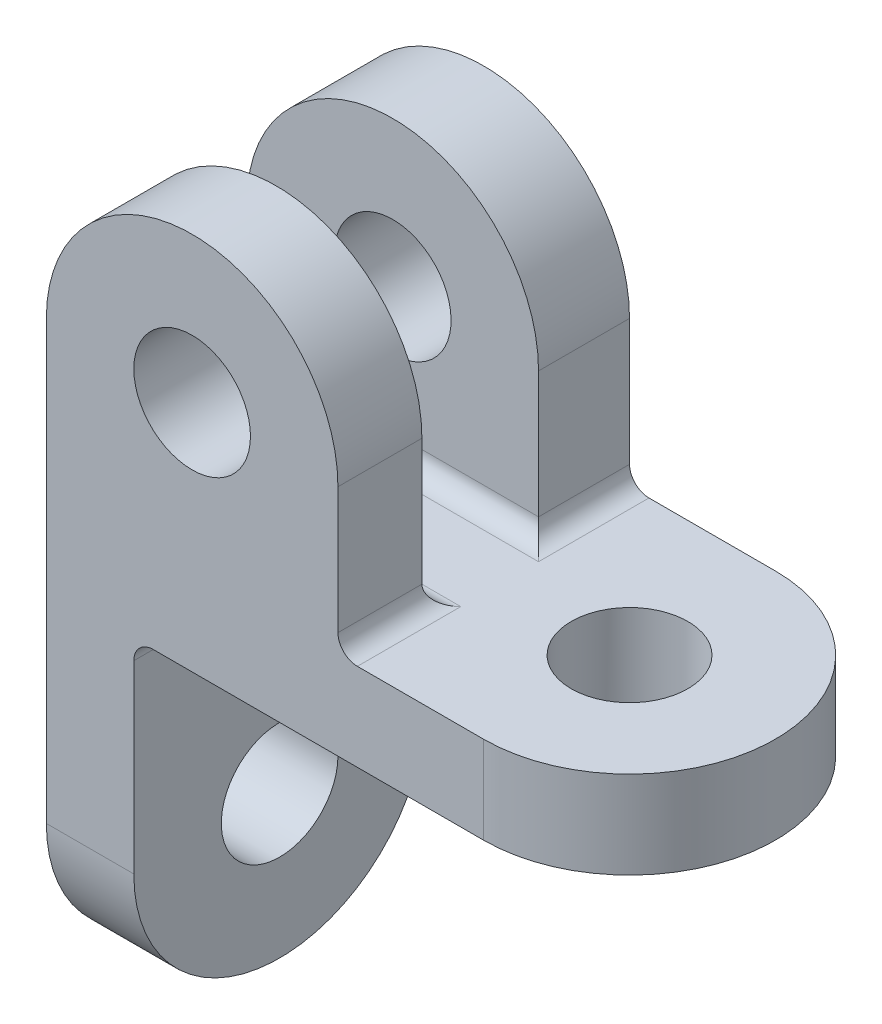
ISO-10303-21;
HEADER;
FILE_DESCRIPTION(('STEP AP214'),'2;1');
FILE_NAME('part.step','',(''),(''),'','','');
FILE_SCHEMA(('AUTOMOTIVE_DESIGN { 1 0 10303 214 1 1 1 1 }'));
ENDSEC;
DATA;
#1=APPLICATION_CONTEXT('core data for automotive mechanical design processes');
#2=APPLICATION_PROTOCOL_DEFINITION('international standard','automotive_design',2000,#1);
#3=PRODUCT_CONTEXT('',#1,'mechanical');
#4=PRODUCT('Part','Part','',(#3));
#5=PRODUCT_RELATED_PRODUCT_CATEGORY('part','',(#4));
#6=PRODUCT_DEFINITION_FORMATION('','',#4);
#7=PRODUCT_DEFINITION_CONTEXT('part definition',#1,'design');
#8=PRODUCT_DEFINITION('design','',#6,#7);
#9=PRODUCT_DEFINITION_SHAPE('','',#8);
#10=(LENGTH_UNIT() NAMED_UNIT(*) SI_UNIT(.MILLI.,.METRE.));
#11=(NAMED_UNIT(*) PLANE_ANGLE_UNIT() SI_UNIT($,.RADIAN.));
#12=(NAMED_UNIT(*) SI_UNIT($,.STERADIAN.) SOLID_ANGLE_UNIT());
#13=UNCERTAINTY_MEASURE_WITH_UNIT(LENGTH_MEASURE(1.E-05),#10,'distance_accuracy_value','');
#14=(GEOMETRIC_REPRESENTATION_CONTEXT(3) GLOBAL_UNCERTAINTY_ASSIGNED_CONTEXT((#13)) GLOBAL_UNIT_ASSIGNED_CONTEXT((#10,
#11,#12)) REPRESENTATION_CONTEXT('',''));
#15=CARTESIAN_POINT('',(0.,0.,0.));
#16=DIRECTION('',(0.,0.,1.));
#17=DIRECTION('',(1.,0.,0.));
#18=AXIS2_PLACEMENT_3D('',#15,#16,#17);
#19=CARTESIAN_POINT('',(0.,15.,30.));
#20=DIRECTION('',(0.,0.,-1.));
#21=DIRECTION('',(-1.,0.,0.));
#22=AXIS2_PLACEMENT_3D('',#19,#20,#21);
#23=CYLINDRICAL_SURFACE('',#22,15.);
#24=CARTESIAN_POINT('',(0.,15.,9.35995053907442));
#25=DIRECTION('',(0.,0.,1.));
#26=DIRECTION('',(0.,-1.,0.));
#27=AXIS2_PLACEMENT_3D('',#24,#25,#26);
#28=CIRCLE('',#27,15.);
#29=CARTESIAN_POINT('',(15.,15.,9.35995053907442));
#30=VERTEX_POINT('',#29);
#31=CARTESIAN_POINT('',(-15.,15.,9.35995053907442));
#32=VERTEX_POINT('',#31);
#33=EDGE_CURVE('E455',#30,#32,#28,.T.);
#34=ORIENTED_EDGE('',*,*,#33,.F.);
#35=DIRECTION('',(0.,0.,-1.));
#36=VECTOR('',#35,1.);
#37=CARTESIAN_POINT('',(15.,15.,30.));
#38=LINE('',#37,#36);
#39=CARTESIAN_POINT('',(15.,15.,0.));
#40=VERTEX_POINT('',#39);
#41=EDGE_CURVE('E189',#30,#40,#38,.T.);
#42=ORIENTED_EDGE('',*,*,#41,.T.);
#43=CARTESIAN_POINT('',(0.,15.,0.));
#44=DIRECTION('',(0.,0.,1.));
#45=DIRECTION('',(1.,0.,0.));
#46=AXIS2_PLACEMENT_3D('',#43,#44,#45);
#47=CIRCLE('',#46,15.);
#48=CARTESIAN_POINT('',(-15.,15.,0.));
#49=VERTEX_POINT('',#48);
#50=EDGE_CURVE('E322',#40,#49,#47,.T.);
#51=ORIENTED_EDGE('',*,*,#50,.T.);
#52=DIRECTION('',(0.,0.,-1.));
#53=VECTOR('',#52,1.);
#54=CARTESIAN_POINT('',(-15.,15.,30.));
#55=LINE('',#54,#53);
#56=EDGE_CURVE('E188',#32,#49,#55,.T.);
#57=ORIENTED_EDGE('',*,*,#56,.F.);
#58=EDGE_LOOP('',(#34,#42,#51,#57));
#59=FACE_BOUND('',#58,.T.);
#60=ADVANCED_FACE('F44',(#59),#23,.T.);
#61=CARTESIAN_POINT('',(0.,15.,21.3599505390744));
#62=DIRECTION('',(0.,0.,-1.));
#63=DIRECTION('',(-1.,0.,0.));
#64=AXIS2_PLACEMENT_3D('',#61,#62,#63);
#65=CIRCLE('',#64,15.);
#66=CARTESIAN_POINT('',(-15.,15.,21.3599505390744));
#67=VERTEX_POINT('',#66);
#68=CARTESIAN_POINT('',(15.,15.,21.3599505390744));
#69=VERTEX_POINT('',#68);
#70=EDGE_CURVE('E160',#67,#69,#65,.T.);
#71=ORIENTED_EDGE('',*,*,#70,.F.);
#72=CARTESIAN_POINT('',(-15.,15.,30.));
#73=VERTEX_POINT('',#72);
#74=EDGE_CURVE('E193',#73,#67,#55,.T.);
#75=ORIENTED_EDGE('',*,*,#74,.F.);
#76=CARTESIAN_POINT('',(0.,15.,30.));
#77=DIRECTION('',(0.,0.,1.));
#78=DIRECTION('',(1.,0.,0.));
#79=AXIS2_PLACEMENT_3D('',#76,#77,#78);
#80=CIRCLE('',#79,15.);
#81=CARTESIAN_POINT('',(15.,15.,30.));
#82=VERTEX_POINT('',#81);
#83=EDGE_CURVE('E186',#82,#73,#80,.T.);
#84=ORIENTED_EDGE('',*,*,#83,.F.);
#85=EDGE_CURVE('E177',#82,#69,#38,.T.);
#86=ORIENTED_EDGE('',*,*,#85,.T.);
#87=EDGE_LOOP('',(#71,#75,#84,#86));
#88=FACE_BOUND('',#87,.T.);
#89=ADVANCED_FACE('F184',(#88),#23,.T.);
#90=CARTESIAN_POINT('',(-15.,15.,30.));
#91=DIRECTION('',(1.,0.,0.));
#92=DIRECTION('',(0.,1.,0.));
#93=AXIS2_PLACEMENT_3D('',#90,#91,#92);
#94=PLANE('',#93);
#95=CARTESIAN_POINT('',(-15.,-30.,15.));
#96=DIRECTION('',(1.,0.,0.));
#97=DIRECTION('',(0.,1.,0.));
#98=AXIS2_PLACEMENT_3D('',#95,#96,#97);
#99=CIRCLE('',#98,6.);
#100=CARTESIAN_POINT('',(-15.,-24.,15.));
#101=VERTEX_POINT('',#100);
#102=EDGE_CURVE('E235',#101,#101,#99,.T.);
#103=ORIENTED_EDGE('',*,*,#102,.T.);
#104=EDGE_LOOP('',(#103));
#105=FACE_BOUND('',#104,.T.);
#106=DIRECTION('',(0.,-1.,0.));
#107=VECTOR('',#106,1.);
#108=CARTESIAN_POINT('',(-15.,15.,9.35995053907442));
#109=LINE('',#108,#107);
#110=CARTESIAN_POINT('',(-15.,1.99999999999999,9.35995053907441));
#111=VERTEX_POINT('',#110);
#112=EDGE_CURVE('E458',#32,#111,#109,.T.);
#113=ORIENTED_EDGE('',*,*,#112,.F.);
#114=ORIENTED_EDGE('',*,*,#56,.T.);
#115=DIRECTION('',(0.,-1.,0.));
#116=VECTOR('',#115,1.);
#117=CARTESIAN_POINT('',(-15.,15.,0.));
#118=LINE('',#117,#116);
#119=CARTESIAN_POINT('',(-15.,-30.,0.));
#120=VERTEX_POINT('',#119);
#121=EDGE_CURVE('E326',#49,#120,#118,.T.);
#122=ORIENTED_EDGE('',*,*,#121,.T.);
#123=CARTESIAN_POINT('',(-15.,-30.,15.));
#124=DIRECTION('',(1.,0.,0.));
#125=DIRECTION('',(0.,1.,0.));
#126=AXIS2_PLACEMENT_3D('',#123,#124,#125);
#127=CIRCLE('',#126,15.);
#128=CARTESIAN_POINT('',(-15.,-30.,30.));
#129=VERTEX_POINT('',#128);
#130=EDGE_CURVE('E225',#120,#129,#127,.F.);
#131=ORIENTED_EDGE('',*,*,#130,.T.);
#132=DIRECTION('',(0.,-1.,0.));
#133=VECTOR('',#132,1.);
#134=CARTESIAN_POINT('',(-15.,15.,30.));
#135=LINE('',#134,#133);
#136=EDGE_CURVE('E345',#73,#129,#135,.T.);
#137=ORIENTED_EDGE('',*,*,#136,.F.);
#138=ORIENTED_EDGE('',*,*,#74,.T.);
#139=DIRECTION('',(0.,1.,0.));
#140=VECTOR('',#139,1.);
#141=CARTESIAN_POINT('',(-15.,15.,21.3599505390744));
#142=LINE('',#141,#140);
#143=CARTESIAN_POINT('',(-15.,1.99999999999999,21.3599505390744));
#144=VERTEX_POINT('',#143);
#145=EDGE_CURVE('E167',#144,#67,#142,.T.);
#146=ORIENTED_EDGE('',*,*,#145,.F.);
#147=CARTESIAN_POINT('',(-15.,1.99999999999999,19.3599505390744));
#148=DIRECTION('',(1.,0.,0.));
#149=DIRECTION('',(0.,1.,0.));
#150=AXIS2_PLACEMENT_3D('',#147,#148,#149);
#151=CIRCLE('',#150,2.);
#152=CARTESIAN_POINT('',(-15.,2.04662675695744E-11,19.3599505390744));
#153=VERTEX_POINT('',#152);
#154=EDGE_CURVE('E279',#144,#153,#151,.T.);
#155=ORIENTED_EDGE('',*,*,#154,.T.);
#156=DIRECTION('',(0.,0.,1.));
#157=VECTOR('',#156,1.);
#158=CARTESIAN_POINT('',(-15.,2.04662675695744E-11,30.));
#159=LINE('',#158,#157);
#160=CARTESIAN_POINT('',(-15.,2.04662675695744E-11,11.3599505390744));
#161=VERTEX_POINT('',#160);
#162=EDGE_CURVE('E462',#161,#153,#159,.T.);
#163=ORIENTED_EDGE('',*,*,#162,.F.);
#164=CARTESIAN_POINT('',(-15.,1.99999999999999,11.3599505390744));
#165=DIRECTION('',(1.,0.,0.));
#166=DIRECTION('',(0.,1.,0.));
#167=AXIS2_PLACEMENT_3D('',#164,#165,#166);
#168=CIRCLE('',#167,2.);
#169=EDGE_CURVE('E276',#161,#111,#168,.T.);
#170=ORIENTED_EDGE('',*,*,#169,.T.);
#171=EDGE_LOOP('',(#113,#114,#122,#131,#137,#138,#146,#155,#163,#170));
#172=FACE_BOUND('',#171,.T.);
#173=ADVANCED_FACE('F393',(#105,#172),#94,.F.);
#174=CARTESIAN_POINT('',(15.,15.,30.));
#175=DIRECTION('',(-1.,4.54728847169387E-13,0.));
#176=DIRECTION('',(-4.54728847169387E-13,-1.,0.));
#177=AXIS2_PLACEMENT_3D('',#174,#175,#176);
#178=PLANE('',#177);
#179=DIRECTION('',(4.54728847169387E-13,1.,0.));
#180=VECTOR('',#179,1.);
#181=CARTESIAN_POINT('',(15.,15.,9.35995053907442));
#182=LINE('',#181,#180);
#183=CARTESIAN_POINT('',(14.9999999999941,2.00000000000091,9.35995053907441));
#184=VERTEX_POINT('',#183);
#185=EDGE_CURVE('E240',#184,#30,#182,.T.);
#186=ORIENTED_EDGE('',*,*,#185,.F.);
#187=DIRECTION('',(0.,0.,-1.));
#188=VECTOR('',#187,1.);
#189=CARTESIAN_POINT('',(14.9999999999941,2.00000000000091,0.));
#190=LINE('',#189,#188);
#191=CARTESIAN_POINT('',(14.9999999999941,2.00000000000091,0.));
#192=VERTEX_POINT('',#191);
#193=EDGE_CURVE('E68',#184,#192,#190,.T.);
#194=ORIENTED_EDGE('',*,*,#193,.T.);
#195=DIRECTION('',(4.54728847169387E-13,1.,0.));
#196=VECTOR('',#195,1.);
#197=CARTESIAN_POINT('',(15.,15.,0.));
#198=LINE('',#197,#196);
#199=EDGE_CURVE('E198',#192,#40,#198,.T.);
#200=ORIENTED_EDGE('',*,*,#199,.T.);
#201=ORIENTED_EDGE('',*,*,#41,.F.);
#202=EDGE_LOOP('',(#186,#194,#200,#201));
#203=FACE_BOUND('',#202,.T.);
#204=ADVANCED_FACE('F398',(#203),#178,.F.);
#205=DIRECTION('',(4.54728847169387E-13,1.,0.));
#206=VECTOR('',#205,1.);
#207=CARTESIAN_POINT('',(15.,15.,30.));
#208=LINE('',#207,#206);
#209=CARTESIAN_POINT('',(14.9999999999941,2.00000000000091,30.));
#210=VERTEX_POINT('',#209);
#211=EDGE_CURVE('E196',#210,#82,#208,.T.);
#212=ORIENTED_EDGE('',*,*,#211,.F.);
#213=DIRECTION('',(0.,0.,-1.));
#214=VECTOR('',#213,1.);
#215=CARTESIAN_POINT('',(14.9999999999941,2.00000000000091,21.3599505390744));
#216=LINE('',#215,#214);
#217=CARTESIAN_POINT('',(14.9999999999941,2.00000000000091,21.3599505390744));
#218=VERTEX_POINT('',#217);
#219=EDGE_CURVE('E180',#210,#218,#216,.T.);
#220=ORIENTED_EDGE('',*,*,#219,.T.);
#221=DIRECTION('',(-4.54728847169387E-13,-1.,0.));
#222=VECTOR('',#221,1.);
#223=CARTESIAN_POINT('',(15.,15.,21.3599505390744));
#224=LINE('',#223,#222);
#225=EDGE_CURVE('E164',#69,#218,#224,.T.);
#226=ORIENTED_EDGE('',*,*,#225,.F.);
#227=ORIENTED_EDGE('',*,*,#85,.F.);
#228=EDGE_LOOP('',(#212,#220,#226,#227));
#229=FACE_BOUND('',#228,.T.);
#230=ADVANCED_FACE('F176',(#229),#178,.F.);
#231=CARTESIAN_POINT('',(0.,15.,30.));
#232=DIRECTION('',(0.,0.,-1.));
#233=DIRECTION('',(-1.,0.,0.));
#234=AXIS2_PLACEMENT_3D('',#231,#232,#233);
#235=CYLINDRICAL_SURFACE('',#234,6.);
#236=CARTESIAN_POINT('',(0.,15.,0.));
#237=DIRECTION('',(0.,0.,1.));
#238=DIRECTION('',(1.,0.,0.));
#239=AXIS2_PLACEMENT_3D('',#236,#237,#238);
#240=CIRCLE('',#239,6.);
#241=CARTESIAN_POINT('',(6.,15.,0.));
#242=VERTEX_POINT('',#241);
#243=EDGE_CURVE('E350',#242,#242,#240,.T.);
#244=ORIENTED_EDGE('',*,*,#243,.F.);
#245=EDGE_LOOP('',(#244));
#246=FACE_BOUND('',#245,.T.);
#247=CARTESIAN_POINT('',(0.,15.,9.35995053907442));
#248=DIRECTION('',(0.,0.,1.));
#249=DIRECTION('',(0.,-1.,0.));
#250=AXIS2_PLACEMENT_3D('',#247,#248,#249);
#251=CIRCLE('',#250,6.);
#252=CARTESIAN_POINT('',(0.,9.,9.35995053907442));
#253=VERTEX_POINT('',#252);
#254=EDGE_CURVE('E236',#253,#253,#251,.T.);
#255=ORIENTED_EDGE('',*,*,#254,.T.);
#256=EDGE_LOOP('',(#255));
#257=FACE_BOUND('',#256,.T.);
#258=ADVANCED_FACE('F415',(#246,#257),#235,.F.);
#259=CARTESIAN_POINT('',(0.,15.,30.));
#260=DIRECTION('',(0.,0.,1.));
#261=DIRECTION('',(1.,0.,0.));
#262=AXIS2_PLACEMENT_3D('',#259,#260,#261);
#263=CIRCLE('',#262,6.);
#264=CARTESIAN_POINT('',(6.,15.,30.));
#265=VERTEX_POINT('',#264);
#266=EDGE_CURVE('E327',#265,#265,#263,.T.);
#267=ORIENTED_EDGE('',*,*,#266,.T.);
#268=EDGE_LOOP('',(#267));
#269=FACE_BOUND('',#268,.T.);
#270=CARTESIAN_POINT('',(0.,15.,21.3599505390744));
#271=DIRECTION('',(0.,0.,-1.));
#272=DIRECTION('',(-1.,0.,0.));
#273=AXIS2_PLACEMENT_3D('',#270,#271,#272);
#274=CIRCLE('',#273,6.);
#275=CARTESIAN_POINT('',(-6.,15.,21.3599505390744));
#276=VERTEX_POINT('',#275);
#277=EDGE_CURVE('E182',#276,#276,#274,.T.);
#278=ORIENTED_EDGE('',*,*,#277,.T.);
#279=EDGE_LOOP('',(#278));
#280=FACE_BOUND('',#279,.T.);
#281=ADVANCED_FACE('F383',(#269,#280),#235,.F.);
#282=CARTESIAN_POINT('',(-15.,-30.,15.));
#283=DIRECTION('',(1.,0.,0.));
#284=DIRECTION('',(0.,0.,-1.));
#285=AXIS2_PLACEMENT_3D('',#282,#283,#284);
#286=CYLINDRICAL_SURFACE('',#285,15.);
#287=DIRECTION('',(-1.,0.,0.));
#288=VECTOR('',#287,1.);
#289=CARTESIAN_POINT('',(-15.,-30.,30.));
#290=LINE('',#289,#288);
#291=CARTESIAN_POINT('',(-5.99999999999999,-30.,30.));
#292=VERTEX_POINT('',#291);
#293=EDGE_CURVE('E217',#129,#292,#290,.F.);
#294=ORIENTED_EDGE('',*,*,#293,.F.);
#295=ORIENTED_EDGE('',*,*,#130,.F.);
#296=DIRECTION('',(1.,0.,0.));
#297=VECTOR('',#296,1.);
#298=CARTESIAN_POINT('',(0.,-30.,0.));
#299=LINE('',#298,#297);
#300=CARTESIAN_POINT('',(-5.99999999999999,-30.,0.));
#301=VERTEX_POINT('',#300);
#302=EDGE_CURVE('E221',#301,#120,#299,.F.);
#303=ORIENTED_EDGE('',*,*,#302,.F.);
#304=CARTESIAN_POINT('',(-5.99999999999999,-30.,15.));
#305=DIRECTION('',(-1.,0.,0.));
#306=DIRECTION('',(0.,0.,1.));
#307=AXIS2_PLACEMENT_3D('',#304,#305,#306);
#308=CIRCLE('',#307,15.);
#309=EDGE_CURVE('E228',#292,#301,#308,.F.);
#310=ORIENTED_EDGE('',*,*,#309,.F.);
#311=EDGE_LOOP('',(#294,#295,#303,#310));
#312=FACE_BOUND('',#311,.T.);
#313=ADVANCED_FACE('F375',(#312),#286,.T.);
#314=CARTESIAN_POINT('',(30.,-9.00000000000001,15.));
#315=DIRECTION('',(0.,1.,0.));
#316=DIRECTION('',(-1.,0.,0.));
#317=AXIS2_PLACEMENT_3D('',#314,#315,#316);
#318=CYLINDRICAL_SURFACE('',#317,15.);
#319=DIRECTION('',(0.,-1.,0.));
#320=VECTOR('',#319,1.);
#321=CARTESIAN_POINT('',(30.,-9.00000000000001,30.));
#322=LINE('',#321,#320);
#323=CARTESIAN_POINT('',(30.,-9.00000000000001,30.));
#324=VERTEX_POINT('',#323);
#325=CARTESIAN_POINT('',(30.,0.,30.));
#326=VERTEX_POINT('',#325);
#327=EDGE_CURVE('E202',#324,#326,#322,.F.);
#328=ORIENTED_EDGE('',*,*,#327,.F.);
#329=CARTESIAN_POINT('',(30.,-8.99999999999999,15.));
#330=DIRECTION('',(0.,1.,0.));
#331=DIRECTION('',(-1.,0.,0.));
#332=AXIS2_PLACEMENT_3D('',#329,#330,#331);
#333=CIRCLE('',#332,15.);
#334=CARTESIAN_POINT('',(30.,-8.99999999999999,0.));
#335=VERTEX_POINT('',#334);
#336=EDGE_CURVE('E210',#335,#324,#333,.F.);
#337=ORIENTED_EDGE('',*,*,#336,.F.);
#338=DIRECTION('',(0.,1.,0.));
#339=VECTOR('',#338,1.);
#340=CARTESIAN_POINT('',(30.,15.,0.));
#341=LINE('',#340,#339);
#342=CARTESIAN_POINT('',(30.,0.,0.));
#343=VERTEX_POINT('',#342);
#344=EDGE_CURVE('E206',#343,#335,#341,.F.);
#345=ORIENTED_EDGE('',*,*,#344,.F.);
#346=CARTESIAN_POINT('',(30.,0.,15.));
#347=DIRECTION('',(0.,-1.,0.));
#348=DIRECTION('',(1.,0.,0.));
#349=AXIS2_PLACEMENT_3D('',#346,#347,#348);
#350=CIRCLE('',#349,15.);
#351=EDGE_CURVE('E214',#326,#343,#350,.F.);
#352=ORIENTED_EDGE('',*,*,#351,.F.);
#353=EDGE_LOOP('',(#328,#337,#345,#352));
#354=FACE_BOUND('',#353,.T.);
#355=ADVANCED_FACE('F373',(#354),#318,.T.);
#356=CARTESIAN_POINT('',(0.,15.,30.));
#357=DIRECTION('',(0.,0.,1.));
#358=DIRECTION('',(1.,0.,0.));
#359=AXIS2_PLACEMENT_3D('',#356,#357,#358);
#360=PLANE('',#359);
#361=ORIENTED_EDGE('',*,*,#136,.T.);
#362=ORIENTED_EDGE('',*,*,#293,.T.);
#363=DIRECTION('',(0.,1.,0.));
#364=VECTOR('',#363,1.);
#365=CARTESIAN_POINT('',(-5.99999999999999,-45.,30.));
#366=LINE('',#365,#364);
#367=CARTESIAN_POINT('',(-5.99999999999999,-11.,30.));
#368=VERTEX_POINT('',#367);
#369=EDGE_CURVE('E318',#292,#368,#366,.T.);
#370=ORIENTED_EDGE('',*,*,#369,.T.);
#371=CARTESIAN_POINT('',(-4.,-11.,30.));
#372=DIRECTION('',(0.,0.,1.));
#373=DIRECTION('',(1.,0.,0.));
#374=AXIS2_PLACEMENT_3D('',#371,#372,#373);
#375=CIRCLE('',#374,2.);
#376=CARTESIAN_POINT('',(-4.,-9.,30.));
#377=VERTEX_POINT('',#376);
#378=EDGE_CURVE('E273',#368,#377,#375,.F.);
#379=ORIENTED_EDGE('',*,*,#378,.T.);
#380=DIRECTION('',(1.,0.,0.));
#381=VECTOR('',#380,1.);
#382=CARTESIAN_POINT('',(-5.99999999999999,-9.,30.));
#383=LINE('',#382,#381);
#384=EDGE_CURVE('E313',#377,#324,#383,.T.);
#385=ORIENTED_EDGE('',*,*,#384,.T.);
#386=ORIENTED_EDGE('',*,*,#327,.T.);
#387=DIRECTION('',(-1.,0.,0.));
#388=VECTOR('',#387,1.);
#389=CARTESIAN_POINT('',(14.9999999999932,0.,30.));
#390=LINE('',#389,#388);
#391=CARTESIAN_POINT('',(16.9999999999941,0.,30.));
#392=VERTEX_POINT('',#391);
#393=EDGE_CURVE('E306',#326,#392,#390,.T.);
#394=ORIENTED_EDGE('',*,*,#393,.T.);
#395=CARTESIAN_POINT('',(16.9999999999941,2.,30.));
#396=DIRECTION('',(0.,0.,1.));
#397=DIRECTION('',(1.,0.,0.));
#398=AXIS2_PLACEMENT_3D('',#395,#396,#397);
#399=CIRCLE('',#398,2.);
#400=EDGE_CURVE('E11',#392,#210,#399,.F.);
#401=ORIENTED_EDGE('',*,*,#400,.T.);
#402=ORIENTED_EDGE('',*,*,#211,.T.);
#403=ORIENTED_EDGE('',*,*,#83,.T.);
#404=EDGE_LOOP('',(#361,#362,#370,#379,#385,#386,#394,#401,#402,#403));
#405=FACE_BOUND('',#404,.T.);
#406=ORIENTED_EDGE('',*,*,#266,.F.);
#407=EDGE_LOOP('',(#406));
#408=FACE_BOUND('',#407,.T.);
#409=ADVANCED_FACE('F309',(#405,#408),#360,.T.);
#410=CARTESIAN_POINT('',(0.,15.,0.));
#411=DIRECTION('',(0.,0.,1.));
#412=DIRECTION('',(1.,0.,0.));
#413=AXIS2_PLACEMENT_3D('',#410,#411,#412);
#414=PLANE('',#413);
#415=DIRECTION('',(0.,1.,0.));
#416=VECTOR('',#415,1.);
#417=CARTESIAN_POINT('',(-5.99999999999999,-45.,0.));
#418=LINE('',#417,#416);
#419=CARTESIAN_POINT('',(-5.99999999999999,-11.,0.));
#420=VERTEX_POINT('',#419);
#421=EDGE_CURVE('E331',#301,#420,#418,.T.);
#422=ORIENTED_EDGE('',*,*,#421,.F.);
#423=ORIENTED_EDGE('',*,*,#302,.T.);
#424=ORIENTED_EDGE('',*,*,#121,.F.);
#425=ORIENTED_EDGE('',*,*,#50,.F.);
#426=ORIENTED_EDGE('',*,*,#199,.F.);
#427=CARTESIAN_POINT('',(16.9999999999941,2.,0.));
#428=DIRECTION('',(0.,0.,1.));
#429=DIRECTION('',(1.,0.,0.));
#430=AXIS2_PLACEMENT_3D('',#427,#428,#429);
#431=CIRCLE('',#430,2.);
#432=CARTESIAN_POINT('',(16.9999999999941,0.,0.));
#433=VERTEX_POINT('',#432);
#434=EDGE_CURVE('E54',#192,#433,#431,.T.);
#435=ORIENTED_EDGE('',*,*,#434,.T.);
#436=DIRECTION('',(-1.,0.,0.));
#437=VECTOR('',#436,1.);
#438=CARTESIAN_POINT('',(14.9999999999932,0.,0.));
#439=LINE('',#438,#437);
#440=EDGE_CURVE('E337',#343,#433,#439,.T.);
#441=ORIENTED_EDGE('',*,*,#440,.F.);
#442=ORIENTED_EDGE('',*,*,#344,.T.);
#443=DIRECTION('',(1.,0.,0.));
#444=VECTOR('',#443,1.);
#445=CARTESIAN_POINT('',(45.,-8.99999999999999,0.));
#446=LINE('',#445,#444);
#447=CARTESIAN_POINT('',(-4.,-9.,0.));
#448=VERTEX_POINT('',#447);
#449=EDGE_CURVE('E335',#448,#335,#446,.T.);
#450=ORIENTED_EDGE('',*,*,#449,.F.);
#451=CARTESIAN_POINT('',(-4.,-11.,0.));
#452=DIRECTION('',(0.,0.,1.));
#453=DIRECTION('',(1.,0.,0.));
#454=AXIS2_PLACEMENT_3D('',#451,#452,#453);
#455=CIRCLE('',#454,2.);
#456=EDGE_CURVE('E270',#448,#420,#455,.T.);
#457=ORIENTED_EDGE('',*,*,#456,.T.);
#458=EDGE_LOOP('',(#422,#423,#424,#425,#426,#435,#441,#442,#450,#457));
#459=FACE_BOUND('',#458,.T.);
#460=ORIENTED_EDGE('',*,*,#243,.T.);
#461=EDGE_LOOP('',(#460));
#462=FACE_BOUND('',#461,.T.);
#463=ADVANCED_FACE('F369',(#459,#462),#414,.F.);
#464=CARTESIAN_POINT('',(-5.99999999999999,-45.,30.));
#465=DIRECTION('',(-1.,0.,0.));
#466=DIRECTION('',(0.,0.,1.));
#467=AXIS2_PLACEMENT_3D('',#464,#465,#466);
#468=PLANE('',#467);
#469=CARTESIAN_POINT('',(-5.99999999999999,-30.,15.));
#470=DIRECTION('',(1.,0.,0.));
#471=DIRECTION('',(0.,0.,-1.));
#472=AXIS2_PLACEMENT_3D('',#469,#470,#471);
#473=CIRCLE('',#472,6.);
#474=CARTESIAN_POINT('',(-5.99999999999999,-30.,9.));
#475=VERTEX_POINT('',#474);
#476=EDGE_CURVE('E442',#475,#475,#473,.T.);
#477=ORIENTED_EDGE('',*,*,#476,.F.);
#478=EDGE_LOOP('',(#477));
#479=FACE_BOUND('',#478,.T.);
#480=ORIENTED_EDGE('',*,*,#421,.T.);
#481=DIRECTION('',(0.,0.,-1.));
#482=VECTOR('',#481,1.);
#483=CARTESIAN_POINT('',(-5.99999999999999,-11.,30.));
#484=LINE('',#483,#482);
#485=EDGE_CURVE('E244',#420,#368,#484,.F.);
#486=ORIENTED_EDGE('',*,*,#485,.T.);
#487=ORIENTED_EDGE('',*,*,#369,.F.);
#488=ORIENTED_EDGE('',*,*,#309,.T.);
#489=EDGE_LOOP('',(#480,#486,#487,#488));
#490=FACE_BOUND('',#489,.T.);
#491=ADVANCED_FACE('F400',(#479,#490),#468,.F.);
#492=CARTESIAN_POINT('',(45.,-8.99999999999999,30.));
#493=DIRECTION('',(0.,1.,0.));
#494=DIRECTION('',(-1.,0.,0.));
#495=AXIS2_PLACEMENT_3D('',#492,#493,#494);
#496=PLANE('',#495);
#497=CARTESIAN_POINT('',(30.,-8.99999999999999,15.));
#498=DIRECTION('',(0.,1.,0.));
#499=DIRECTION('',(-1.,0.,0.));
#500=AXIS2_PLACEMENT_3D('',#497,#498,#499);
#501=CIRCLE('',#500,6.);
#502=CARTESIAN_POINT('',(24.,-9.,15.));
#503=VERTEX_POINT('',#502);
#504=EDGE_CURVE('E294',#503,#503,#501,.T.);
#505=ORIENTED_EDGE('',*,*,#504,.T.);
#506=EDGE_LOOP('',(#505));
#507=FACE_BOUND('',#506,.T.);
#508=ORIENTED_EDGE('',*,*,#384,.F.);
#509=DIRECTION('',(0.,0.,-1.));
#510=VECTOR('',#509,1.);
#511=CARTESIAN_POINT('',(-4.,-9.,0.));
#512=LINE('',#511,#510);
#513=EDGE_CURVE('E231',#377,#448,#512,.T.);
#514=ORIENTED_EDGE('',*,*,#513,.T.);
#515=ORIENTED_EDGE('',*,*,#449,.T.);
#516=ORIENTED_EDGE('',*,*,#336,.T.);
#517=EDGE_LOOP('',(#508,#514,#515,#516));
#518=FACE_BOUND('',#517,.T.);
#519=ADVANCED_FACE('F365',(#507,#518),#496,.F.);
#520=CARTESIAN_POINT('',(14.9999999999932,0.,30.));
#521=DIRECTION('',(0.,-1.,0.));
#522=DIRECTION('',(1.,0.,0.));
#523=AXIS2_PLACEMENT_3D('',#520,#521,#522);
#524=PLANE('',#523);
#525=CARTESIAN_POINT('',(30.,0.,15.));
#526=DIRECTION('',(0.,1.,0.));
#527=DIRECTION('',(0.,0.,1.));
#528=AXIS2_PLACEMENT_3D('',#525,#526,#527);
#529=CIRCLE('',#528,6.);
#530=CARTESIAN_POINT('',(30.,0.,21.));
#531=VERTEX_POINT('',#530);
#532=EDGE_CURVE('E286',#531,#531,#529,.T.);
#533=ORIENTED_EDGE('',*,*,#532,.F.);
#534=EDGE_LOOP('',(#533));
#535=FACE_BOUND('',#534,.T.);
#536=DIRECTION('',(0.,0.,-1.));
#537=VECTOR('',#536,1.);
#538=CARTESIAN_POINT('',(16.9999999999941,0.,9.35995053907442));
#539=LINE('',#538,#537);
#540=CARTESIAN_POINT('',(16.9999999999941,0.,11.3599505390744));
#541=VERTEX_POINT('',#540);
#542=EDGE_CURVE('E253',#433,#541,#539,.F.);
#543=ORIENTED_EDGE('',*,*,#542,.T.);
#544=DIRECTION('',(-1.,0.,0.));
#545=VECTOR('',#544,1.);
#546=CARTESIAN_POINT('',(14.9999999999932,0.,11.3599505390744));
#547=LINE('',#546,#545);
#548=EDGE_CURVE('E256',#541,#161,#547,.T.);
#549=ORIENTED_EDGE('',*,*,#548,.T.);
#550=ORIENTED_EDGE('',*,*,#162,.T.);
#551=DIRECTION('',(-1.,0.,0.));
#552=VECTOR('',#551,1.);
#553=CARTESIAN_POINT('',(14.9999999999932,0.,19.3599505390744));
#554=LINE('',#553,#552);
#555=CARTESIAN_POINT('',(16.9999999999941,0.,19.3599505390744));
#556=VERTEX_POINT('',#555);
#557=EDGE_CURVE('E250',#153,#556,#554,.F.);
#558=ORIENTED_EDGE('',*,*,#557,.T.);
#559=DIRECTION('',(0.,0.,-1.));
#560=VECTOR('',#559,1.);
#561=CARTESIAN_POINT('',(16.9999999999941,0.,30.));
#562=LINE('',#561,#560);
#563=EDGE_CURVE('E247',#556,#392,#562,.F.);
#564=ORIENTED_EDGE('',*,*,#563,.T.);
#565=ORIENTED_EDGE('',*,*,#393,.F.);
#566=ORIENTED_EDGE('',*,*,#351,.T.);
#567=ORIENTED_EDGE('',*,*,#440,.T.);
#568=EDGE_LOOP('',(#543,#549,#550,#558,#564,#565,#566,#567));
#569=FACE_BOUND('',#568,.T.);
#570=ADVANCED_FACE('F305',(#535,#569),#524,.F.);
#571=CARTESIAN_POINT('',(25.0000000000118,40.9707741730373,9.35995053907442));
#572=DIRECTION('',(0.,0.,1.));
#573=DIRECTION('',(0.,-1.,0.));
#574=AXIS2_PLACEMENT_3D('',#571,#572,#573);
#575=PLANE('',#574);
#576=ORIENTED_EDGE('',*,*,#254,.F.);
#577=EDGE_LOOP('',(#576));
#578=FACE_BOUND('',#577,.T.);
#579=ORIENTED_EDGE('',*,*,#112,.T.);
#580=DIRECTION('',(-1.,0.,0.));
#581=VECTOR('',#580,1.);
#582=CARTESIAN_POINT('',(25.0000000000118,2.,9.35995053907441));
#583=LINE('',#582,#581);
#584=EDGE_CURVE('E260',#111,#184,#583,.F.);
#585=ORIENTED_EDGE('',*,*,#584,.T.);
#586=ORIENTED_EDGE('',*,*,#185,.T.);
#587=ORIENTED_EDGE('',*,*,#33,.T.);
#588=EDGE_LOOP('',(#579,#585,#586,#587));
#589=FACE_BOUND('',#588,.T.);
#590=ADVANCED_FACE('F409',(#578,#589),#575,.T.);
#591=CARTESIAN_POINT('',(24.9999999999932,2.27823666134684E-12,21.3599505390744));
#592=DIRECTION('',(0.,0.,-1.));
#593=DIRECTION('',(-1.,0.,0.));
#594=AXIS2_PLACEMENT_3D('',#591,#592,#593);
#595=PLANE('',#594);
#596=ORIENTED_EDGE('',*,*,#277,.F.);
#597=EDGE_LOOP('',(#596));
#598=FACE_BOUND('',#597,.T.);
#599=ORIENTED_EDGE('',*,*,#225,.T.);
#600=DIRECTION('',(-1.,0.,0.));
#601=VECTOR('',#600,1.);
#602=CARTESIAN_POINT('',(24.9999999999932,2.,21.3599505390744));
#603=LINE('',#602,#601);
#604=EDGE_CURVE('E263',#218,#144,#603,.T.);
#605=ORIENTED_EDGE('',*,*,#604,.T.);
#606=ORIENTED_EDGE('',*,*,#145,.T.);
#607=ORIENTED_EDGE('',*,*,#70,.T.);
#608=EDGE_LOOP('',(#599,#605,#606,#607));
#609=FACE_BOUND('',#608,.T.);
#610=ADVANCED_FACE('F162',(#598,#609),#595,.T.);
#611=CARTESIAN_POINT('',(-5.99999999999999,-30.,15.));
#612=DIRECTION('',(1.,0.,0.));
#613=DIRECTION('',(0.,0.,-1.));
#614=AXIS2_PLACEMENT_3D('',#611,#612,#613);
#615=CYLINDRICAL_SURFACE('',#614,6.);
#616=ORIENTED_EDGE('',*,*,#476,.T.);
#617=EDGE_LOOP('',(#616));
#618=FACE_BOUND('',#617,.T.);
#619=ORIENTED_EDGE('',*,*,#102,.F.);
#620=EDGE_LOOP('',(#619));
#621=FACE_BOUND('',#620,.T.);
#622=ADVANCED_FACE('F424',(#618,#621),#615,.F.);
#623=CARTESIAN_POINT('',(30.,0.,15.));
#624=DIRECTION('',(0.,1.,0.));
#625=DIRECTION('',(0.,0.,1.));
#626=AXIS2_PLACEMENT_3D('',#623,#624,#625);
#627=CYLINDRICAL_SURFACE('',#626,6.);
#628=ORIENTED_EDGE('',*,*,#532,.T.);
#629=EDGE_LOOP('',(#628));
#630=FACE_BOUND('',#629,.T.);
#631=ORIENTED_EDGE('',*,*,#504,.F.);
#632=EDGE_LOOP('',(#631));
#633=FACE_BOUND('',#632,.T.);
#634=ADVANCED_FACE('F428',(#630,#633),#627,.F.);
#635=CARTESIAN_POINT('',(-4.,-11.,30.));
#636=DIRECTION('',(0.,0.,1.));
#637=DIRECTION('',(1.,0.,0.));
#638=AXIS2_PLACEMENT_3D('',#635,#636,#637);
#639=CYLINDRICAL_SURFACE('',#638,2.);
#640=ORIENTED_EDGE('',*,*,#378,.F.);
#641=ORIENTED_EDGE('',*,*,#485,.F.);
#642=ORIENTED_EDGE('',*,*,#456,.F.);
#643=ORIENTED_EDGE('',*,*,#513,.F.);
#644=EDGE_LOOP('',(#640,#641,#642,#643));
#645=FACE_BOUND('',#644,.T.);
#646=ADVANCED_FACE('F362',(#645),#639,.F.);
#647=CARTESIAN_POINT('',(16.9999999999941,2.,30.));
#648=DIRECTION('',(0.,0.,1.));
#649=DIRECTION('',(1.,0.,0.));
#650=AXIS2_PLACEMENT_3D('',#647,#648,#649);
#651=CYLINDRICAL_SURFACE('',#650,2.);
#652=ORIENTED_EDGE('',*,*,#434,.F.);
#653=ORIENTED_EDGE('',*,*,#193,.F.);
#654=CARTESIAN_POINT('',(16.9999999999941,2.,11.3599505390744));
#655=DIRECTION('',(-0.707106781186547,0.,0.707106781186547));
#656=DIRECTION('',(0.707106781186547,0.,0.707106781186547));
#657=AXIS2_PLACEMENT_3D('',#654,#655,#656);
#658=ELLIPSE('',#657,2.82842712474619,2.);
#659=EDGE_CURVE('E283',#541,#184,#658,.F.);
#660=ORIENTED_EDGE('',*,*,#659,.F.);
#661=ORIENTED_EDGE('',*,*,#542,.F.);
#662=EDGE_LOOP('',(#652,#653,#660,#661));
#663=FACE_BOUND('',#662,.T.);
#664=ADVANCED_FACE('F435',(#663),#651,.F.);
#665=CARTESIAN_POINT('',(14.9999999999932,2.,11.3599505390744));
#666=DIRECTION('',(-1.,0.,0.));
#667=DIRECTION('',(0.,-1.,0.));
#668=AXIS2_PLACEMENT_3D('',#665,#666,#667);
#669=CYLINDRICAL_SURFACE('',#668,2.);
#670=ORIENTED_EDGE('',*,*,#659,.T.);
#671=ORIENTED_EDGE('',*,*,#584,.F.);
#672=ORIENTED_EDGE('',*,*,#169,.F.);
#673=ORIENTED_EDGE('',*,*,#548,.F.);
#674=EDGE_LOOP('',(#670,#671,#672,#673));
#675=FACE_BOUND('',#674,.T.);
#676=ADVANCED_FACE('F477',(#675),#669,.F.);
#677=CARTESIAN_POINT('',(16.9999999999941,2.,30.));
#678=DIRECTION('',(0.,0.,1.));
#679=DIRECTION('',(1.,0.,0.));
#680=AXIS2_PLACEMENT_3D('',#677,#678,#679);
#681=CYLINDRICAL_SURFACE('',#680,2.);
#682=ORIENTED_EDGE('',*,*,#400,.F.);
#683=ORIENTED_EDGE('',*,*,#563,.F.);
#684=CARTESIAN_POINT('',(16.9999999999941,2.,19.3599505390744));
#685=DIRECTION('',(0.707106781186547,0.,0.707106781186547));
#686=DIRECTION('',(-0.707106781186547,0.,0.707106781186547));
#687=AXIS2_PLACEMENT_3D('',#684,#685,#686);
#688=ELLIPSE('',#687,2.82842712474619,2.);
#689=EDGE_CURVE('E48',#218,#556,#688,.T.);
#690=ORIENTED_EDGE('',*,*,#689,.F.);
#691=ORIENTED_EDGE('',*,*,#219,.F.);
#692=EDGE_LOOP('',(#682,#683,#690,#691));
#693=FACE_BOUND('',#692,.T.);
#694=ADVANCED_FACE('F46',(#693),#681,.F.);
#695=CARTESIAN_POINT('',(24.9999999999932,2.,19.3599505390744));
#696=DIRECTION('',(-1.,0.,0.));
#697=DIRECTION('',(0.,-1.,0.));
#698=AXIS2_PLACEMENT_3D('',#695,#696,#697);
#699=CYLINDRICAL_SURFACE('',#698,2.);
#700=ORIENTED_EDGE('',*,*,#689,.T.);
#701=ORIENTED_EDGE('',*,*,#557,.F.);
#702=ORIENTED_EDGE('',*,*,#154,.F.);
#703=ORIENTED_EDGE('',*,*,#604,.F.);
#704=EDGE_LOOP('',(#700,#701,#702,#703));
#705=FACE_BOUND('',#704,.T.);
#706=ADVANCED_FACE('F300',(#705),#699,.F.);
#707=CLOSED_SHELL('',(#60,#89,#173,#204,#230,#258,#281,#313,#355,#409,#463,#491,#519,#570,#590,
#610,#622,#634,#646,#664,#676,#694,#706));
#708=MANIFOLD_SOLID_BREP('B2',#707);
#709=ADVANCED_BREP_SHAPE_REPRESENTATION('',(#18,#708),#14);
#710=SHAPE_DEFINITION_REPRESENTATION(#9,#709);
ENDSEC;
END-ISO-10303-21;
